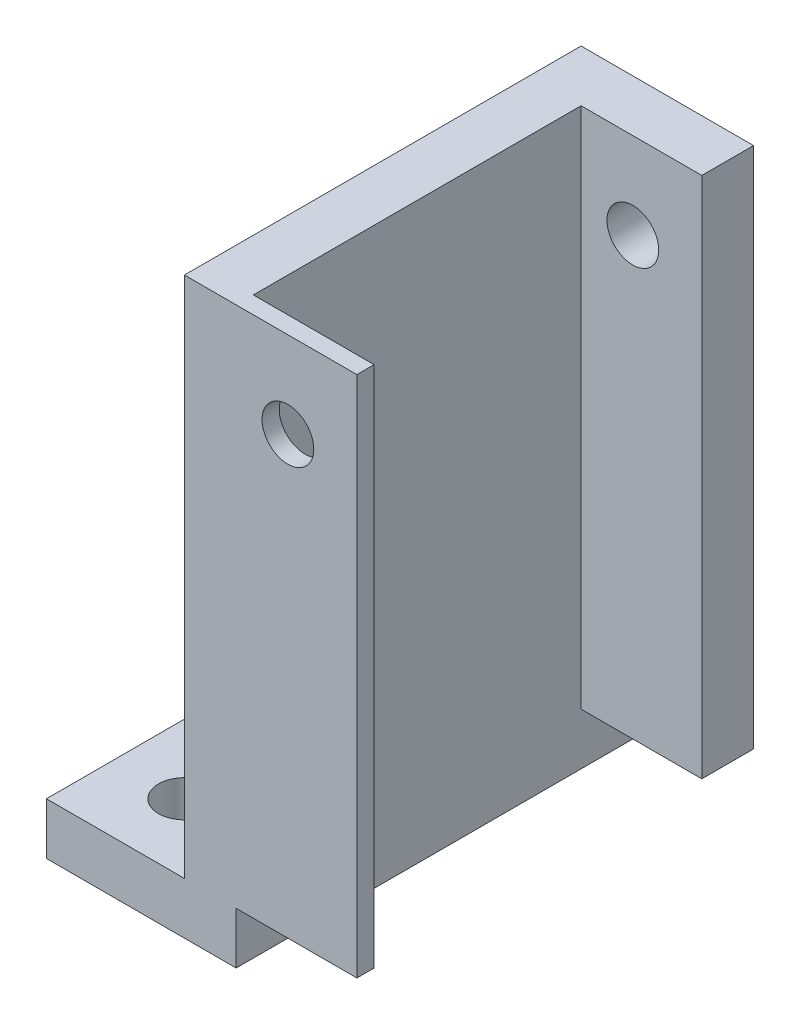
ISO-10303-21;
HEADER;
FILE_DESCRIPTION(('STEP AP214'),'2;1');
FILE_NAME('part.step','',(''),(''),'','','');
FILE_SCHEMA(('AUTOMOTIVE_DESIGN { 1 0 10303 214 1 1 1 1 }'));
ENDSEC;
DATA;
#1=APPLICATION_CONTEXT('core data for automotive mechanical design processes');
#2=APPLICATION_PROTOCOL_DEFINITION('international standard','automotive_design',2000,#1);
#3=PRODUCT_CONTEXT('',#1,'mechanical');
#4=PRODUCT('Part','Part','',(#3));
#5=PRODUCT_RELATED_PRODUCT_CATEGORY('part','',(#4));
#6=PRODUCT_DEFINITION_FORMATION('','',#4);
#7=PRODUCT_DEFINITION_CONTEXT('part definition',#1,'design');
#8=PRODUCT_DEFINITION('design','',#6,#7);
#9=PRODUCT_DEFINITION_SHAPE('','',#8);
#10=(LENGTH_UNIT() NAMED_UNIT(*) SI_UNIT(.MILLI.,.METRE.));
#11=(NAMED_UNIT(*) PLANE_ANGLE_UNIT() SI_UNIT($,.RADIAN.));
#12=(NAMED_UNIT(*) SI_UNIT($,.STERADIAN.) SOLID_ANGLE_UNIT());
#13=UNCERTAINTY_MEASURE_WITH_UNIT(LENGTH_MEASURE(1.E-05),#10,'distance_accuracy_value','');
#14=(GEOMETRIC_REPRESENTATION_CONTEXT(3) GLOBAL_UNCERTAINTY_ASSIGNED_CONTEXT((#13)) GLOBAL_UNIT_ASSIGNED_CONTEXT((#10,
#11,#12)) REPRESENTATION_CONTEXT('',''));
#15=CARTESIAN_POINT('',(0.,0.,0.));
#16=DIRECTION('',(0.,0.,1.));
#17=DIRECTION('',(1.,0.,0.));
#18=AXIS2_PLACEMENT_3D('',#15,#16,#17);
#19=CARTESIAN_POINT('',(10.,-30.3,23.));
#20=DIRECTION('',(0.,1.,0.));
#21=DIRECTION('',(0.,0.,1.));
#22=AXIS2_PLACEMENT_3D('',#19,#20,#21);
#23=PLANE('',#22);
#24=DIRECTION('',(0.,0.,1.));
#25=VECTOR('',#24,1.);
#26=CARTESIAN_POINT('',(3.,-30.3,23.));
#27=LINE('',#26,#25);
#28=CARTESIAN_POINT('',(3.,-30.3,0.));
#29=VERTEX_POINT('',#28);
#30=CARTESIAN_POINT('',(3.,-30.3,3.));
#31=VERTEX_POINT('',#30);
#32=EDGE_CURVE('E56',#29,#31,#27,.T.);
#33=ORIENTED_EDGE('',*,*,#32,.F.);
#34=DIRECTION('',(-1.,0.,0.));
#35=VECTOR('',#34,1.);
#36=CARTESIAN_POINT('',(10.,-30.3,0.));
#37=LINE('',#36,#35);
#38=CARTESIAN_POINT('',(10.,-30.3,0.));
#39=VERTEX_POINT('',#38);
#40=EDGE_CURVE('E225',#39,#29,#37,.T.);
#41=ORIENTED_EDGE('',*,*,#40,.F.);
#42=DIRECTION('',(0.,0.,-1.));
#43=VECTOR('',#42,1.);
#44=CARTESIAN_POINT('',(10.,-30.3,23.));
#45=LINE('',#44,#43);
#46=CARTESIAN_POINT('',(10.,-30.3,3.));
#47=VERTEX_POINT('',#46);
#48=EDGE_CURVE('E210',#47,#39,#45,.T.);
#49=ORIENTED_EDGE('',*,*,#48,.F.);
#50=DIRECTION('',(-1.,0.,0.));
#51=VECTOR('',#50,1.);
#52=CARTESIAN_POINT('',(10.,-30.3,3.));
#53=LINE('',#52,#51);
#54=EDGE_CURVE('E279',#47,#31,#53,.T.);
#55=ORIENTED_EDGE('',*,*,#54,.T.);
#56=EDGE_LOOP('',(#33,#41,#49,#55));
#57=FACE_BOUND('',#56,.T.);
#58=ADVANCED_FACE('F33',(#57),#23,.F.);
#59=CARTESIAN_POINT('',(3.,-30.3,22.));
#60=VERTEX_POINT('',#59);
#61=CARTESIAN_POINT('',(3.,-30.3,23.));
#62=VERTEX_POINT('',#61);
#63=EDGE_CURVE('E146',#60,#62,#27,.T.);
#64=ORIENTED_EDGE('',*,*,#63,.F.);
#65=DIRECTION('',(1.,0.,0.));
#66=VECTOR('',#65,1.);
#67=CARTESIAN_POINT('',(10.,-30.3,22.));
#68=LINE('',#67,#66);
#69=CARTESIAN_POINT('',(10.,-30.3,22.));
#70=VERTEX_POINT('',#69);
#71=EDGE_CURVE('E206',#60,#70,#68,.T.);
#72=ORIENTED_EDGE('',*,*,#71,.T.);
#73=CARTESIAN_POINT('',(10.,-30.3,23.));
#74=VERTEX_POINT('',#73);
#75=EDGE_CURVE('E211',#74,#70,#45,.T.);
#76=ORIENTED_EDGE('',*,*,#75,.F.);
#77=DIRECTION('',(-1.,0.,0.));
#78=VECTOR('',#77,1.);
#79=CARTESIAN_POINT('',(10.,-30.3,23.));
#80=LINE('',#79,#78);
#81=EDGE_CURVE('E234',#74,#62,#80,.T.);
#82=ORIENTED_EDGE('',*,*,#81,.T.);
#83=EDGE_LOOP('',(#64,#72,#76,#82));
#84=FACE_BOUND('',#83,.T.);
#85=ADVANCED_FACE('F292',(#84),#23,.F.);
#86=CARTESIAN_POINT('',(10.,0.,0.));
#87=DIRECTION('',(1.,0.,0.));
#88=DIRECTION('',(0.,0.,-1.));
#89=AXIS2_PLACEMENT_3D('',#86,#87,#88);
#90=PLANE('',#89);
#91=DIRECTION('',(0.,1.,0.));
#92=VECTOR('',#91,1.);
#93=CARTESIAN_POINT('',(10.,-30.3,22.));
#94=LINE('',#93,#92);
#95=CARTESIAN_POINT('',(10.,0.,22.));
#96=VERTEX_POINT('',#95);
#97=EDGE_CURVE('E186',#70,#96,#94,.T.);
#98=ORIENTED_EDGE('',*,*,#97,.T.);
#99=DIRECTION('',(0.,0.,1.));
#100=VECTOR('',#99,1.);
#101=CARTESIAN_POINT('',(10.,0.,23.));
#102=LINE('',#101,#100);
#103=CARTESIAN_POINT('',(10.,0.,23.));
#104=VERTEX_POINT('',#103);
#105=EDGE_CURVE('E213',#96,#104,#102,.T.);
#106=ORIENTED_EDGE('',*,*,#105,.T.);
#107=DIRECTION('',(0.,-1.,0.));
#108=VECTOR('',#107,1.);
#109=CARTESIAN_POINT('',(10.,0.,23.));
#110=LINE('',#109,#108);
#111=EDGE_CURVE('E207',#104,#74,#110,.T.);
#112=ORIENTED_EDGE('',*,*,#111,.T.);
#113=ORIENTED_EDGE('',*,*,#75,.T.);
#114=EDGE_LOOP('',(#98,#106,#112,#113));
#115=FACE_BOUND('',#114,.T.);
#116=ADVANCED_FACE('F295',(#115),#90,.T.);
#117=CARTESIAN_POINT('',(10.,0.,23.));
#118=DIRECTION('',(0.,0.,-1.));
#119=DIRECTION('',(0.,1.,0.));
#120=AXIS2_PLACEMENT_3D('',#117,#118,#119);
#121=PLANE('',#120);
#122=CARTESIAN_POINT('',(6.,-5.,23.));
#123=DIRECTION('',(0.,0.,1.));
#124=DIRECTION('',(1.,0.,0.));
#125=AXIS2_PLACEMENT_3D('',#122,#123,#124);
#126=CIRCLE('',#125,1.5);
#127=CARTESIAN_POINT('',(7.5,-5.,23.));
#128=VERTEX_POINT('',#127);
#129=EDGE_CURVE('E348',#128,#128,#126,.T.);
#130=ORIENTED_EDGE('',*,*,#129,.F.);
#131=EDGE_LOOP('',(#130));
#132=FACE_BOUND('',#131,.T.);
#133=DIRECTION('',(0.,-1.,0.));
#134=VECTOR('',#133,1.);
#135=CARTESIAN_POINT('',(0.,0.,23.));
#136=LINE('',#135,#134);
#137=CARTESIAN_POINT('',(0.,0.,23.));
#138=VERTEX_POINT('',#137);
#139=CARTESIAN_POINT('',(0.,-30.3,23.));
#140=VERTEX_POINT('',#139);
#141=EDGE_CURVE('E165',#138,#140,#136,.T.);
#142=ORIENTED_EDGE('',*,*,#141,.T.);
#143=DIRECTION('',(-1.,0.,0.));
#144=VECTOR('',#143,1.);
#145=CARTESIAN_POINT('',(3.,-30.3,23.));
#146=LINE('',#145,#144);
#147=CARTESIAN_POINT('',(-8.,-30.3,23.));
#148=VERTEX_POINT('',#147);
#149=EDGE_CURVE('E251',#140,#148,#146,.T.);
#150=ORIENTED_EDGE('',*,*,#149,.T.);
#151=DIRECTION('',(0.,1.,0.));
#152=VECTOR('',#151,1.);
#153=CARTESIAN_POINT('',(-8.,-33.3,23.));
#154=LINE('',#153,#152);
#155=CARTESIAN_POINT('',(-8.,-33.3,23.));
#156=VERTEX_POINT('',#155);
#157=EDGE_CURVE('E253',#156,#148,#154,.T.);
#158=ORIENTED_EDGE('',*,*,#157,.F.);
#159=DIRECTION('',(-1.,0.,0.));
#160=VECTOR('',#159,1.);
#161=CARTESIAN_POINT('',(3.,-33.3,23.));
#162=LINE('',#161,#160);
#163=CARTESIAN_POINT('',(3.,-33.3,23.));
#164=VERTEX_POINT('',#163);
#165=EDGE_CURVE('E373',#164,#156,#162,.T.);
#166=ORIENTED_EDGE('',*,*,#165,.F.);
#167=DIRECTION('',(0.,1.,0.));
#168=VECTOR('',#167,1.);
#169=CARTESIAN_POINT('',(3.,-33.3,23.));
#170=LINE('',#169,#168);
#171=EDGE_CURVE('E238',#164,#62,#170,.T.);
#172=ORIENTED_EDGE('',*,*,#171,.T.);
#173=ORIENTED_EDGE('',*,*,#81,.F.);
#174=ORIENTED_EDGE('',*,*,#111,.F.);
#175=DIRECTION('',(-1.,0.,0.));
#176=VECTOR('',#175,1.);
#177=CARTESIAN_POINT('',(10.,0.,23.));
#178=LINE('',#177,#176);
#179=EDGE_CURVE('E219',#104,#138,#178,.T.);
#180=ORIENTED_EDGE('',*,*,#179,.T.);
#181=EDGE_LOOP('',(#142,#150,#158,#166,#172,#173,#174,#180));
#182=FACE_BOUND('',#181,.T.);
#183=ADVANCED_FACE('F35',(#132,#182),#121,.F.);
#184=CARTESIAN_POINT('',(10.,0.,0.));
#185=DIRECTION('',(0.,0.,1.));
#186=DIRECTION('',(0.,-1.,0.));
#187=AXIS2_PLACEMENT_3D('',#184,#185,#186);
#188=PLANE('',#187);
#189=CARTESIAN_POINT('',(6.,-5.,0.));
#190=DIRECTION('',(0.,0.,1.));
#191=DIRECTION('',(0.,-1.,0.));
#192=AXIS2_PLACEMENT_3D('',#189,#190,#191);
#193=CIRCLE('',#192,1.5);
#194=CARTESIAN_POINT('',(6.,-6.5,0.));
#195=VERTEX_POINT('',#194);
#196=EDGE_CURVE('E358',#195,#195,#193,.T.);
#197=ORIENTED_EDGE('',*,*,#196,.T.);
#198=EDGE_LOOP('',(#197));
#199=FACE_BOUND('',#198,.T.);
#200=DIRECTION('',(0.,1.,0.));
#201=VECTOR('',#200,1.);
#202=CARTESIAN_POINT('',(0.,0.,0.));
#203=LINE('',#202,#201);
#204=CARTESIAN_POINT('',(0.,-30.3,0.));
#205=VERTEX_POINT('',#204);
#206=CARTESIAN_POINT('',(0.,0.,0.));
#207=VERTEX_POINT('',#206);
#208=EDGE_CURVE('E179',#205,#207,#203,.T.);
#209=ORIENTED_EDGE('',*,*,#208,.T.);
#210=DIRECTION('',(-1.,0.,0.));
#211=VECTOR('',#210,1.);
#212=CARTESIAN_POINT('',(10.,0.,0.));
#213=LINE('',#212,#211);
#214=CARTESIAN_POINT('',(10.,0.,0.));
#215=VERTEX_POINT('',#214);
#216=EDGE_CURVE('E222',#215,#207,#213,.T.);
#217=ORIENTED_EDGE('',*,*,#216,.F.);
#218=DIRECTION('',(0.,1.,0.));
#219=VECTOR('',#218,1.);
#220=CARTESIAN_POINT('',(10.,0.,0.));
#221=LINE('',#220,#219);
#222=EDGE_CURVE('E212',#39,#215,#221,.T.);
#223=ORIENTED_EDGE('',*,*,#222,.F.);
#224=ORIENTED_EDGE('',*,*,#40,.T.);
#225=DIRECTION('',(0.,1.,0.));
#226=VECTOR('',#225,1.);
#227=CARTESIAN_POINT('',(3.,-33.3,0.));
#228=LINE('',#227,#226);
#229=CARTESIAN_POINT('',(3.,-33.3,0.));
#230=VERTEX_POINT('',#229);
#231=EDGE_CURVE('E265',#230,#29,#228,.T.);
#232=ORIENTED_EDGE('',*,*,#231,.F.);
#233=DIRECTION('',(1.,0.,0.));
#234=VECTOR('',#233,1.);
#235=CARTESIAN_POINT('',(3.,-33.3,0.));
#236=LINE('',#235,#234);
#237=CARTESIAN_POINT('',(-8.,-33.3,0.));
#238=VERTEX_POINT('',#237);
#239=EDGE_CURVE('E243',#238,#230,#236,.T.);
#240=ORIENTED_EDGE('',*,*,#239,.F.);
#241=DIRECTION('',(0.,1.,0.));
#242=VECTOR('',#241,1.);
#243=CARTESIAN_POINT('',(-8.,-33.3,0.));
#244=LINE('',#243,#242);
#245=CARTESIAN_POINT('',(-8.,-30.3,0.));
#246=VERTEX_POINT('',#245);
#247=EDGE_CURVE('E263',#238,#246,#244,.T.);
#248=ORIENTED_EDGE('',*,*,#247,.T.);
#249=DIRECTION('',(1.,0.,0.));
#250=VECTOR('',#249,1.);
#251=CARTESIAN_POINT('',(3.,-30.3,0.));
#252=LINE('',#251,#250);
#253=EDGE_CURVE('E255',#246,#205,#252,.T.);
#254=ORIENTED_EDGE('',*,*,#253,.T.);
#255=EDGE_LOOP('',(#209,#217,#223,#224,#232,#240,#248,#254));
#256=FACE_BOUND('',#255,.T.);
#257=ADVANCED_FACE('F315',(#199,#256),#188,.F.);
#258=CARTESIAN_POINT('',(10.,0.,23.));
#259=DIRECTION('',(0.,-1.,0.));
#260=DIRECTION('',(0.,0.,-1.));
#261=AXIS2_PLACEMENT_3D('',#258,#259,#260);
#262=PLANE('',#261);
#263=ORIENTED_EDGE('',*,*,#105,.F.);
#264=DIRECTION('',(1.,0.,0.));
#265=VECTOR('',#264,1.);
#266=CARTESIAN_POINT('',(10.,0.,22.));
#267=LINE('',#266,#265);
#268=CARTESIAN_POINT('',(3.,0.,22.));
#269=VERTEX_POINT('',#268);
#270=EDGE_CURVE('E202',#269,#96,#267,.T.);
#271=ORIENTED_EDGE('',*,*,#270,.F.);
#272=DIRECTION('',(0.,0.,1.));
#273=VECTOR('',#272,1.);
#274=CARTESIAN_POINT('',(3.,0.,3.));
#275=LINE('',#274,#273);
#276=CARTESIAN_POINT('',(3.,0.,3.));
#277=VERTEX_POINT('',#276);
#278=EDGE_CURVE('E303',#277,#269,#275,.T.);
#279=ORIENTED_EDGE('',*,*,#278,.F.);
#280=DIRECTION('',(-1.,0.,0.));
#281=VECTOR('',#280,1.);
#282=CARTESIAN_POINT('',(10.,0.,3.));
#283=LINE('',#282,#281);
#284=CARTESIAN_POINT('',(10.,0.,3.));
#285=VERTEX_POINT('',#284);
#286=EDGE_CURVE('E307',#285,#277,#283,.T.);
#287=ORIENTED_EDGE('',*,*,#286,.F.);
#288=EDGE_CURVE('E171',#215,#285,#102,.T.);
#289=ORIENTED_EDGE('',*,*,#288,.F.);
#290=ORIENTED_EDGE('',*,*,#216,.T.);
#291=DIRECTION('',(0.,0.,1.));
#292=VECTOR('',#291,1.);
#293=CARTESIAN_POINT('',(0.,0.,23.));
#294=LINE('',#293,#292);
#295=EDGE_CURVE('E173',#207,#138,#294,.T.);
#296=ORIENTED_EDGE('',*,*,#295,.T.);
#297=ORIENTED_EDGE('',*,*,#179,.F.);
#298=EDGE_LOOP('',(#263,#271,#279,#287,#289,#290,#296,#297));
#299=FACE_BOUND('',#298,.T.);
#300=ADVANCED_FACE('F312',(#299),#262,.F.);
#301=DIRECTION('',(0.,1.,0.));
#302=VECTOR('',#301,1.);
#303=CARTESIAN_POINT('',(10.,-30.3,3.));
#304=LINE('',#303,#302);
#305=EDGE_CURVE('E204',#47,#285,#304,.T.);
#306=ORIENTED_EDGE('',*,*,#305,.F.);
#307=ORIENTED_EDGE('',*,*,#48,.T.);
#308=ORIENTED_EDGE('',*,*,#222,.T.);
#309=ORIENTED_EDGE('',*,*,#288,.T.);
#310=EDGE_LOOP('',(#306,#307,#308,#309));
#311=FACE_BOUND('',#310,.T.);
#312=ADVANCED_FACE('F314',(#311),#90,.T.);
#313=CARTESIAN_POINT('',(0.,0.,0.));
#314=DIRECTION('',(1.,0.,0.));
#315=DIRECTION('',(0.,0.,-1.));
#316=AXIS2_PLACEMENT_3D('',#313,#314,#315);
#317=PLANE('',#316);
#318=DIRECTION('',(0.,0.,-1.));
#319=VECTOR('',#318,1.);
#320=CARTESIAN_POINT('',(0.,-25.3502525316942,0.));
#321=LINE('',#320,#319);
#322=CARTESIAN_POINT('',(0.,-25.3502525316942,8.));
#323=VERTEX_POINT('',#322);
#324=CARTESIAN_POINT('',(0.,-25.3502525316942,15.));
#325=VERTEX_POINT('',#324);
#326=EDGE_CURVE('E153',#323,#325,#321,.F.);
#327=ORIENTED_EDGE('',*,*,#326,.T.);
#328=DIRECTION('',(0.,-1.,0.));
#329=VECTOR('',#328,1.);
#330=CARTESIAN_POINT('',(0.,0.,15.));
#331=LINE('',#330,#329);
#332=CARTESIAN_POINT('',(-2.30327909522821E-12,-30.3,15.));
#333=VERTEX_POINT('',#332);
#334=EDGE_CURVE('E347',#325,#333,#331,.T.);
#335=ORIENTED_EDGE('',*,*,#334,.T.);
#336=DIRECTION('',(0.,0.,-1.));
#337=VECTOR('',#336,1.);
#338=CARTESIAN_POINT('',(0.,-30.3,23.));
#339=LINE('',#338,#337);
#340=EDGE_CURVE('E164',#140,#333,#339,.T.);
#341=ORIENTED_EDGE('',*,*,#340,.F.);
#342=ORIENTED_EDGE('',*,*,#141,.F.);
#343=ORIENTED_EDGE('',*,*,#295,.F.);
#344=ORIENTED_EDGE('',*,*,#208,.F.);
#345=CARTESIAN_POINT('',(0.,-30.3,8.));
#346=VERTEX_POINT('',#345);
#347=EDGE_CURVE('E161',#346,#205,#339,.T.);
#348=ORIENTED_EDGE('',*,*,#347,.F.);
#349=DIRECTION('',(0.,-1.,0.));
#350=VECTOR('',#349,1.);
#351=CARTESIAN_POINT('',(0.,0.,8.));
#352=LINE('',#351,#350);
#353=EDGE_CURVE('E48',#323,#346,#352,.T.);
#354=ORIENTED_EDGE('',*,*,#353,.F.);
#355=EDGE_LOOP('',(#327,#335,#341,#342,#343,#344,#348,#354));
#356=FACE_BOUND('',#355,.T.);
#357=ADVANCED_FACE('F321',(#356),#317,.F.);
#358=CARTESIAN_POINT('',(10.,-30.3,22.));
#359=DIRECTION('',(0.,0.,1.));
#360=DIRECTION('',(1.,0.,0.));
#361=AXIS2_PLACEMENT_3D('',#358,#359,#360);
#362=PLANE('',#361);
#363=CARTESIAN_POINT('',(6.,-5.,22.));
#364=DIRECTION('',(0.,0.,1.));
#365=DIRECTION('',(1.,0.,0.));
#366=AXIS2_PLACEMENT_3D('',#363,#364,#365);
#367=CIRCLE('',#366,1.5);
#368=CARTESIAN_POINT('',(7.5,-5.,22.));
#369=VERTEX_POINT('',#368);
#370=EDGE_CURVE('E355',#369,#369,#367,.T.);
#371=ORIENTED_EDGE('',*,*,#370,.T.);
#372=EDGE_LOOP('',(#371));
#373=FACE_BOUND('',#372,.T.);
#374=ORIENTED_EDGE('',*,*,#270,.T.);
#375=ORIENTED_EDGE('',*,*,#97,.F.);
#376=ORIENTED_EDGE('',*,*,#71,.F.);
#377=DIRECTION('',(0.,1.,0.));
#378=VECTOR('',#377,1.);
#379=CARTESIAN_POINT('',(3.,-30.3,22.));
#380=LINE('',#379,#378);
#381=EDGE_CURVE('E193',#60,#269,#380,.T.);
#382=ORIENTED_EDGE('',*,*,#381,.T.);
#383=EDGE_LOOP('',(#374,#375,#376,#382));
#384=FACE_BOUND('',#383,.T.);
#385=ADVANCED_FACE('F305',(#373,#384),#362,.F.);
#386=CARTESIAN_POINT('',(3.,-30.3,3.));
#387=DIRECTION('',(-1.,0.,0.));
#388=DIRECTION('',(0.,0.,1.));
#389=AXIS2_PLACEMENT_3D('',#386,#387,#388);
#390=PLANE('',#389);
#391=ORIENTED_EDGE('',*,*,#171,.F.);
#392=DIRECTION('',(0.,0.,1.));
#393=VECTOR('',#392,1.);
#394=CARTESIAN_POINT('',(3.,-33.3,23.));
#395=LINE('',#394,#393);
#396=EDGE_CURVE('E259',#230,#164,#395,.T.);
#397=ORIENTED_EDGE('',*,*,#396,.F.);
#398=ORIENTED_EDGE('',*,*,#231,.T.);
#399=ORIENTED_EDGE('',*,*,#32,.T.);
#400=DIRECTION('',(0.,1.,0.));
#401=VECTOR('',#400,1.);
#402=CARTESIAN_POINT('',(3.,-30.3,3.));
#403=LINE('',#402,#401);
#404=EDGE_CURVE('E198',#31,#277,#403,.T.);
#405=ORIENTED_EDGE('',*,*,#404,.T.);
#406=ORIENTED_EDGE('',*,*,#278,.T.);
#407=ORIENTED_EDGE('',*,*,#381,.F.);
#408=ORIENTED_EDGE('',*,*,#63,.T.);
#409=EDGE_LOOP('',(#391,#397,#398,#399,#405,#406,#407,#408));
#410=FACE_BOUND('',#409,.T.);
#411=ADVANCED_FACE('F300',(#410),#390,.F.);
#412=CARTESIAN_POINT('',(10.,-30.3,3.));
#413=DIRECTION('',(0.,0.,-1.));
#414=DIRECTION('',(-1.,0.,0.));
#415=AXIS2_PLACEMENT_3D('',#412,#413,#414);
#416=PLANE('',#415);
#417=CARTESIAN_POINT('',(6.,-5.,3.));
#418=DIRECTION('',(0.,0.,-1.));
#419=DIRECTION('',(-1.,0.,0.));
#420=AXIS2_PLACEMENT_3D('',#417,#418,#419);
#421=CIRCLE('',#420,1.5);
#422=CARTESIAN_POINT('',(4.5,-5.,3.));
#423=VERTEX_POINT('',#422);
#424=EDGE_CURVE('E166',#423,#423,#421,.T.);
#425=ORIENTED_EDGE('',*,*,#424,.T.);
#426=EDGE_LOOP('',(#425));
#427=FACE_BOUND('',#426,.T.);
#428=ORIENTED_EDGE('',*,*,#286,.T.);
#429=ORIENTED_EDGE('',*,*,#404,.F.);
#430=ORIENTED_EDGE('',*,*,#54,.F.);
#431=ORIENTED_EDGE('',*,*,#305,.T.);
#432=EDGE_LOOP('',(#428,#429,#430,#431));
#433=FACE_BOUND('',#432,.T.);
#434=ADVANCED_FACE('F311',(#427,#433),#416,.F.);
#435=CARTESIAN_POINT('',(-8.,-33.3,23.));
#436=DIRECTION('',(1.,0.,0.));
#437=DIRECTION('',(0.,0.,-1.));
#438=AXIS2_PLACEMENT_3D('',#435,#436,#437);
#439=PLANE('',#438);
#440=DIRECTION('',(0.,0.,-1.));
#441=VECTOR('',#440,1.);
#442=CARTESIAN_POINT('',(-8.,-30.3,23.));
#443=LINE('',#442,#441);
#444=EDGE_CURVE('E260',#148,#246,#443,.T.);
#445=ORIENTED_EDGE('',*,*,#444,.T.);
#446=ORIENTED_EDGE('',*,*,#247,.F.);
#447=DIRECTION('',(0.,0.,-1.));
#448=VECTOR('',#447,1.);
#449=CARTESIAN_POINT('',(-8.,-33.3,23.));
#450=LINE('',#449,#448);
#451=EDGE_CURVE('E275',#156,#238,#450,.T.);
#452=ORIENTED_EDGE('',*,*,#451,.F.);
#453=ORIENTED_EDGE('',*,*,#157,.T.);
#454=EDGE_LOOP('',(#445,#446,#452,#453));
#455=FACE_BOUND('',#454,.T.);
#456=ADVANCED_FACE('F380',(#455),#439,.F.);
#457=CARTESIAN_POINT('',(0.,-33.3,0.));
#458=DIRECTION('',(0.,1.,0.));
#459=DIRECTION('',(0.,0.,1.));
#460=AXIS2_PLACEMENT_3D('',#457,#458,#459);
#461=PLANE('',#460);
#462=ORIENTED_EDGE('',*,*,#396,.T.);
#463=ORIENTED_EDGE('',*,*,#165,.T.);
#464=ORIENTED_EDGE('',*,*,#451,.T.);
#465=ORIENTED_EDGE('',*,*,#239,.T.);
#466=EDGE_LOOP('',(#462,#463,#464,#465));
#467=FACE_BOUND('',#466,.T.);
#468=CARTESIAN_POINT('',(-4.,-33.3,19.));
#469=DIRECTION('',(0.,1.,0.));
#470=DIRECTION('',(0.,0.,1.));
#471=AXIS2_PLACEMENT_3D('',#468,#469,#470);
#472=CIRCLE('',#471,1.5);
#473=CARTESIAN_POINT('',(-4.,-33.3,20.5));
#474=VERTEX_POINT('',#473);
#475=EDGE_CURVE('E364',#474,#474,#472,.T.);
#476=ORIENTED_EDGE('',*,*,#475,.T.);
#477=EDGE_LOOP('',(#476));
#478=FACE_BOUND('',#477,.T.);
#479=CARTESIAN_POINT('',(-4.,-33.3,3.99999999999999));
#480=DIRECTION('',(0.,1.,0.));
#481=DIRECTION('',(0.,0.,1.));
#482=AXIS2_PLACEMENT_3D('',#479,#480,#481);
#483=CIRCLE('',#482,1.5);
#484=CARTESIAN_POINT('',(-4.,-33.3,5.49999999999999));
#485=VERTEX_POINT('',#484);
#486=EDGE_CURVE('E252',#485,#485,#483,.T.);
#487=ORIENTED_EDGE('',*,*,#486,.T.);
#488=EDGE_LOOP('',(#487));
#489=FACE_BOUND('',#488,.T.);
#490=ADVANCED_FACE('F376',(#467,#478,#489),#461,.F.);
#491=CARTESIAN_POINT('',(0.,-30.3,0.));
#492=DIRECTION('',(0.,1.,0.));
#493=DIRECTION('',(0.,0.,1.));
#494=AXIS2_PLACEMENT_3D('',#491,#492,#493);
#495=PLANE('',#494);
#496=DIRECTION('',(1.,0.,0.));
#497=VECTOR('',#496,1.);
#498=CARTESIAN_POINT('',(0.,-30.3,15.));
#499=LINE('',#498,#497);
#500=CARTESIAN_POINT('',(-4.94974746830586,-30.3,15.));
#501=VERTEX_POINT('',#500);
#502=EDGE_CURVE('E11',#501,#333,#499,.T.);
#503=ORIENTED_EDGE('',*,*,#502,.F.);
#504=DIRECTION('',(0.,0.,-1.));
#505=VECTOR('',#504,1.);
#506=CARTESIAN_POINT('',(-4.94974746830586,-30.3,0.));
#507=LINE('',#506,#505);
#508=CARTESIAN_POINT('',(-4.94974746830586,-30.3,8.));
#509=VERTEX_POINT('',#508);
#510=EDGE_CURVE('E41',#509,#501,#507,.F.);
#511=ORIENTED_EDGE('',*,*,#510,.F.);
#512=DIRECTION('',(1.,0.,0.));
#513=VECTOR('',#512,1.);
#514=CARTESIAN_POINT('',(0.,-30.3,8.));
#515=LINE('',#514,#513);
#516=EDGE_CURVE('E139',#509,#346,#515,.T.);
#517=ORIENTED_EDGE('',*,*,#516,.T.);
#518=ORIENTED_EDGE('',*,*,#347,.T.);
#519=ORIENTED_EDGE('',*,*,#253,.F.);
#520=ORIENTED_EDGE('',*,*,#444,.F.);
#521=ORIENTED_EDGE('',*,*,#149,.F.);
#522=ORIENTED_EDGE('',*,*,#340,.T.);
#523=EDGE_LOOP('',(#503,#511,#517,#518,#519,#520,#521,#522));
#524=FACE_BOUND('',#523,.T.);
#525=CARTESIAN_POINT('',(-4.,-30.3,19.));
#526=DIRECTION('',(0.,1.,0.));
#527=DIRECTION('',(0.,0.,1.));
#528=AXIS2_PLACEMENT_3D('',#525,#526,#527);
#529=CIRCLE('',#528,1.5);
#530=CARTESIAN_POINT('',(-4.,-30.3,20.5));
#531=VERTEX_POINT('',#530);
#532=EDGE_CURVE('E361',#531,#531,#529,.T.);
#533=ORIENTED_EDGE('',*,*,#532,.F.);
#534=EDGE_LOOP('',(#533));
#535=FACE_BOUND('',#534,.T.);
#536=CARTESIAN_POINT('',(-4.,-30.3,3.99999999999999));
#537=DIRECTION('',(0.,1.,0.));
#538=DIRECTION('',(0.,0.,1.));
#539=AXIS2_PLACEMENT_3D('',#536,#537,#538);
#540=CIRCLE('',#539,1.5);
#541=CARTESIAN_POINT('',(-4.,-30.3,5.49999999999999));
#542=VERTEX_POINT('',#541);
#543=EDGE_CURVE('E367',#542,#542,#540,.T.);
#544=ORIENTED_EDGE('',*,*,#543,.F.);
#545=EDGE_LOOP('',(#544));
#546=FACE_BOUND('',#545,.T.);
#547=ADVANCED_FACE('F157',(#524,#535,#546),#495,.T.);
#548=CARTESIAN_POINT('',(-4.,-33.300025,3.99999999999999));
#549=DIRECTION('',(0.,1.,0.));
#550=DIRECTION('',(0.,0.,1.));
#551=AXIS2_PLACEMENT_3D('',#548,#549,#550);
#552=CYLINDRICAL_SURFACE('',#551,1.5);
#553=ORIENTED_EDGE('',*,*,#543,.T.);
#554=EDGE_LOOP('',(#553));
#555=FACE_BOUND('',#554,.T.);
#556=ORIENTED_EDGE('',*,*,#486,.F.);
#557=EDGE_LOOP('',(#556));
#558=FACE_BOUND('',#557,.T.);
#559=ADVANCED_FACE('F476',(#555,#558),#552,.F.);
#560=CARTESIAN_POINT('',(-4.,-33.300025,19.));
#561=DIRECTION('',(0.,1.,0.));
#562=DIRECTION('',(0.,0.,1.));
#563=AXIS2_PLACEMENT_3D('',#560,#561,#562);
#564=CYLINDRICAL_SURFACE('',#563,1.5);
#565=ORIENTED_EDGE('',*,*,#532,.T.);
#566=EDGE_LOOP('',(#565));
#567=FACE_BOUND('',#566,.T.);
#568=ORIENTED_EDGE('',*,*,#475,.F.);
#569=EDGE_LOOP('',(#568));
#570=FACE_BOUND('',#569,.T.);
#571=ADVANCED_FACE('F420',(#567,#570),#564,.F.);
#572=CARTESIAN_POINT('',(6.,-5.,-5.00000000049072E-05));
#573=DIRECTION('',(0.,0.,1.));
#574=DIRECTION('',(1.,0.,0.));
#575=AXIS2_PLACEMENT_3D('',#572,#573,#574);
#576=CYLINDRICAL_SURFACE('',#575,1.5);
#577=ORIENTED_EDGE('',*,*,#424,.F.);
#578=EDGE_LOOP('',(#577));
#579=FACE_BOUND('',#578,.T.);
#580=ORIENTED_EDGE('',*,*,#196,.F.);
#581=EDGE_LOOP('',(#580));
#582=FACE_BOUND('',#581,.T.);
#583=ADVANCED_FACE('F414',(#579,#582),#576,.F.);
#584=ORIENTED_EDGE('',*,*,#129,.T.);
#585=EDGE_LOOP('',(#584));
#586=FACE_BOUND('',#585,.T.);
#587=ORIENTED_EDGE('',*,*,#370,.F.);
#588=EDGE_LOOP('',(#587));
#589=FACE_BOUND('',#588,.T.);
#590=ADVANCED_FACE('F419',(#586,#589),#576,.F.);
#591=CARTESIAN_POINT('',(-4.94974746830586,-30.3,11.5));
#592=DIRECTION('',(0.707106781186544,-0.707106781186551,0.));
#593=DIRECTION('',(0.707106781186551,0.707106781186544,0.));
#594=AXIS2_PLACEMENT_3D('',#591,#592,#593);
#595=PLANE('',#594);
#596=ORIENTED_EDGE('',*,*,#326,.F.);
#597=DIRECTION('',(0.707106781186551,0.707106781186544,0.));
#598=VECTOR('',#597,1.);
#599=CARTESIAN_POINT('',(-4.94974746830586,-30.3,8.));
#600=LINE('',#599,#598);
#601=EDGE_CURVE('E142',#509,#323,#600,.T.);
#602=ORIENTED_EDGE('',*,*,#601,.F.);
#603=ORIENTED_EDGE('',*,*,#510,.T.);
#604=DIRECTION('',(0.707106781186551,0.707106781186544,0.));
#605=VECTOR('',#604,1.);
#606=CARTESIAN_POINT('',(-4.94974746830586,-30.3,15.));
#607=LINE('',#606,#605);
#608=EDGE_CURVE('E154',#501,#325,#607,.T.);
#609=ORIENTED_EDGE('',*,*,#608,.T.);
#610=EDGE_LOOP('',(#596,#602,#603,#609));
#611=FACE_BOUND('',#610,.T.);
#612=ADVANCED_FACE('F149',(#611),#595,.F.);
#613=CARTESIAN_POINT('',(1.,-16.65,15.));
#614=DIRECTION('',(0.,0.,1.));
#615=DIRECTION('',(1.,0.,0.));
#616=AXIS2_PLACEMENT_3D('',#613,#614,#615);
#617=PLANE('',#616);
#618=ORIENTED_EDGE('',*,*,#502,.T.);
#619=ORIENTED_EDGE('',*,*,#334,.F.);
#620=ORIENTED_EDGE('',*,*,#608,.F.);
#621=EDGE_LOOP('',(#618,#619,#620));
#622=FACE_BOUND('',#621,.T.);
#623=ADVANCED_FACE('F522',(#622),#617,.T.);
#624=CARTESIAN_POINT('',(1.,-16.65,8.));
#625=DIRECTION('',(0.,0.,1.));
#626=DIRECTION('',(1.,0.,0.));
#627=AXIS2_PLACEMENT_3D('',#624,#625,#626);
#628=PLANE('',#627);
#629=ORIENTED_EDGE('',*,*,#601,.T.);
#630=ORIENTED_EDGE('',*,*,#353,.T.);
#631=ORIENTED_EDGE('',*,*,#516,.F.);
#632=EDGE_LOOP('',(#629,#630,#631));
#633=FACE_BOUND('',#632,.T.);
#634=ADVANCED_FACE('F141',(#633),#628,.F.);
#635=CLOSED_SHELL('',(#58,#85,#116,#183,#257,#300,#312,#357,#385,#411,#434,#456,#490,#547,#559,
#571,#583,#590,#612,#623,#634));
#636=MANIFOLD_SOLID_BREP('B2',#635);
#637=ADVANCED_BREP_SHAPE_REPRESENTATION('',(#18,#636),#14);
#638=SHAPE_DEFINITION_REPRESENTATION(#9,#637);
ENDSEC;
END-ISO-10303-21;
